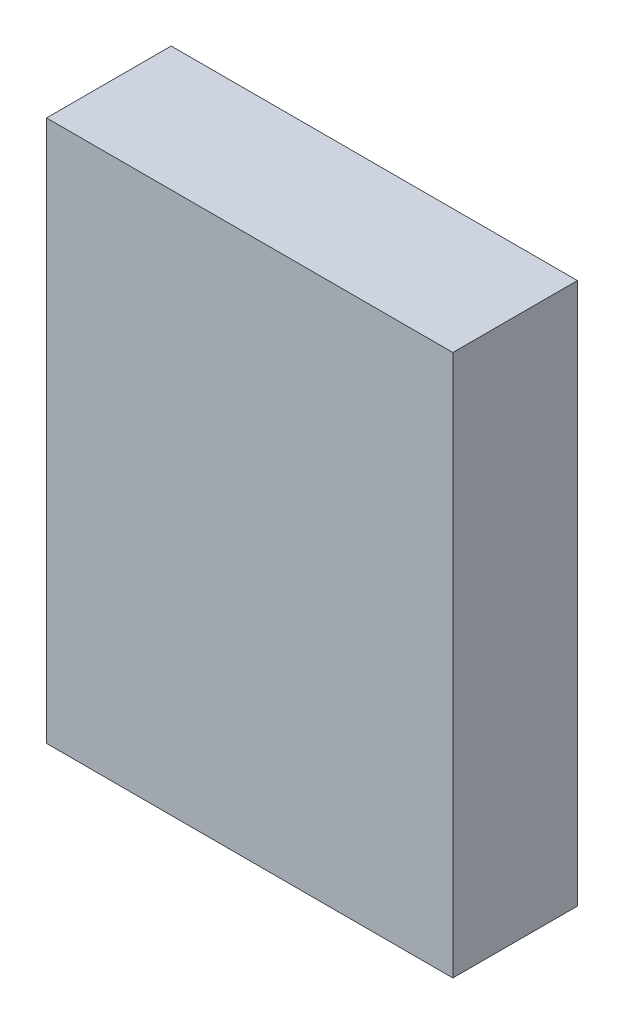
ISO-10303-21;
HEADER;
FILE_DESCRIPTION(('STEP AP214'),'2;1');
FILE_NAME('part.step','',(''),(''),'','','');
FILE_SCHEMA(('AUTOMOTIVE_DESIGN { 1 0 10303 214 1 1 1 1 }'));
ENDSEC;
DATA;
#1=APPLICATION_CONTEXT('core data for automotive mechanical design processes');
#2=APPLICATION_PROTOCOL_DEFINITION('international standard','automotive_design',2000,#1);
#3=PRODUCT_CONTEXT('',#1,'mechanical');
#4=PRODUCT('Part','Part','',(#3));
#5=PRODUCT_RELATED_PRODUCT_CATEGORY('part','',(#4));
#6=PRODUCT_DEFINITION_FORMATION('','',#4);
#7=PRODUCT_DEFINITION_CONTEXT('part definition',#1,'design');
#8=PRODUCT_DEFINITION('design','',#6,#7);
#9=PRODUCT_DEFINITION_SHAPE('','',#8);
#10=(LENGTH_UNIT() NAMED_UNIT(*) SI_UNIT(.MILLI.,.METRE.));
#11=(NAMED_UNIT(*) PLANE_ANGLE_UNIT() SI_UNIT($,.RADIAN.));
#12=(NAMED_UNIT(*) SI_UNIT($,.STERADIAN.) SOLID_ANGLE_UNIT());
#13=UNCERTAINTY_MEASURE_WITH_UNIT(LENGTH_MEASURE(1.E-05),#10,'distance_accuracy_value','');
#14=(GEOMETRIC_REPRESENTATION_CONTEXT(3) GLOBAL_UNCERTAINTY_ASSIGNED_CONTEXT((#13)) GLOBAL_UNIT_ASSIGNED_CONTEXT((#10,
#11,#12)) REPRESENTATION_CONTEXT('',''));
#15=CARTESIAN_POINT('',(0.,0.,0.));
#16=DIRECTION('',(0.,0.,1.));
#17=DIRECTION('',(1.,0.,0.));
#18=AXIS2_PLACEMENT_3D('',#15,#16,#17);
#19=CARTESIAN_POINT('',(0.,0.,2.3));
#20=DIRECTION('',(1.,0.,0.));
#21=DIRECTION('',(0.,0.,-1.));
#22=AXIS2_PLACEMENT_3D('',#19,#20,#21);
#23=PLANE('',#22);
#24=DIRECTION('',(0.,-1.,0.));
#25=VECTOR('',#24,1.);
#26=CARTESIAN_POINT('',(0.,0.,0.));
#27=LINE('',#26,#25);
#28=CARTESIAN_POINT('',(0.,10.,0.));
#29=VERTEX_POINT('',#28);
#30=CARTESIAN_POINT('',(0.,0.,0.));
#31=VERTEX_POINT('',#30);
#32=EDGE_CURVE('E79',#29,#31,#27,.T.);
#33=ORIENTED_EDGE('',*,*,#32,.T.);
#34=DIRECTION('',(0.,0.,-1.));
#35=VECTOR('',#34,1.);
#36=CARTESIAN_POINT('',(0.,0.,2.3));
#37=LINE('',#36,#35);
#38=CARTESIAN_POINT('',(0.,0.,2.3));
#39=VERTEX_POINT('',#38);
#40=EDGE_CURVE('E11',#39,#31,#37,.T.);
#41=ORIENTED_EDGE('',*,*,#40,.F.);
#42=DIRECTION('',(0.,-1.,0.));
#43=VECTOR('',#42,1.);
#44=CARTESIAN_POINT('',(0.,0.,2.3));
#45=LINE('',#44,#43);
#46=CARTESIAN_POINT('',(0.,10.,2.3));
#47=VERTEX_POINT('',#46);
#48=EDGE_CURVE('E67',#47,#39,#45,.T.);
#49=ORIENTED_EDGE('',*,*,#48,.F.);
#50=DIRECTION('',(0.,0.,-1.));
#51=VECTOR('',#50,1.);
#52=CARTESIAN_POINT('',(0.,10.,2.3));
#53=LINE('',#52,#51);
#54=EDGE_CURVE('E75',#47,#29,#53,.T.);
#55=ORIENTED_EDGE('',*,*,#54,.T.);
#56=EDGE_LOOP('',(#33,#41,#49,#55));
#57=FACE_BOUND('',#56,.T.);
#58=ADVANCED_FACE('F16',(#57),#23,.F.);
#59=CARTESIAN_POINT('',(0.,0.,2.3));
#60=DIRECTION('',(0.,1.,0.));
#61=DIRECTION('',(0.,0.,1.));
#62=AXIS2_PLACEMENT_3D('',#59,#60,#61);
#63=PLANE('',#62);
#64=DIRECTION('',(1.,0.,0.));
#65=VECTOR('',#64,1.);
#66=CARTESIAN_POINT('',(0.,0.,0.));
#67=LINE('',#66,#65);
#68=CARTESIAN_POINT('',(7.5,0.,0.));
#69=VERTEX_POINT('',#68);
#70=EDGE_CURVE('E71',#31,#69,#67,.T.);
#71=ORIENTED_EDGE('',*,*,#70,.T.);
#72=DIRECTION('',(0.,0.,-1.));
#73=VECTOR('',#72,1.);
#74=CARTESIAN_POINT('',(7.5,0.,2.3));
#75=LINE('',#74,#73);
#76=CARTESIAN_POINT('',(7.5,0.,2.3));
#77=VERTEX_POINT('',#76);
#78=EDGE_CURVE('E24',#77,#69,#75,.T.);
#79=ORIENTED_EDGE('',*,*,#78,.F.);
#80=DIRECTION('',(1.,0.,0.));
#81=VECTOR('',#80,1.);
#82=CARTESIAN_POINT('',(0.,0.,2.3));
#83=LINE('',#82,#81);
#84=EDGE_CURVE('E62',#39,#77,#83,.T.);
#85=ORIENTED_EDGE('',*,*,#84,.F.);
#86=ORIENTED_EDGE('',*,*,#40,.T.);
#87=EDGE_LOOP('',(#71,#79,#85,#86));
#88=FACE_BOUND('',#87,.T.);
#89=ADVANCED_FACE('F70',(#88),#63,.F.);
#90=CARTESIAN_POINT('',(7.5,0.,2.3));
#91=DIRECTION('',(-1.,0.,0.));
#92=DIRECTION('',(0.,0.,1.));
#93=AXIS2_PLACEMENT_3D('',#90,#91,#92);
#94=PLANE('',#93);
#95=DIRECTION('',(0.,1.,0.));
#96=VECTOR('',#95,1.);
#97=CARTESIAN_POINT('',(7.5,0.,0.));
#98=LINE('',#97,#96);
#99=CARTESIAN_POINT('',(7.5,10.,0.));
#100=VERTEX_POINT('',#99);
#101=EDGE_CURVE('E49',#69,#100,#98,.T.);
#102=ORIENTED_EDGE('',*,*,#101,.T.);
#103=DIRECTION('',(0.,0.,-1.));
#104=VECTOR('',#103,1.);
#105=CARTESIAN_POINT('',(7.5,10.,2.3));
#106=LINE('',#105,#104);
#107=CARTESIAN_POINT('',(7.5,10.,2.3));
#108=VERTEX_POINT('',#107);
#109=EDGE_CURVE('E72',#108,#100,#106,.T.);
#110=ORIENTED_EDGE('',*,*,#109,.F.);
#111=DIRECTION('',(0.,1.,0.));
#112=VECTOR('',#111,1.);
#113=CARTESIAN_POINT('',(7.5,0.,2.3));
#114=LINE('',#113,#112);
#115=EDGE_CURVE('E65',#77,#108,#114,.T.);
#116=ORIENTED_EDGE('',*,*,#115,.F.);
#117=ORIENTED_EDGE('',*,*,#78,.T.);
#118=EDGE_LOOP('',(#102,#110,#116,#117));
#119=FACE_BOUND('',#118,.T.);
#120=ADVANCED_FACE('F73',(#119),#94,.F.);
#121=CARTESIAN_POINT('',(0.,10.,2.3));
#122=DIRECTION('',(0.,-1.,0.));
#123=DIRECTION('',(0.,0.,-1.));
#124=AXIS2_PLACEMENT_3D('',#121,#122,#123);
#125=PLANE('',#124);
#126=DIRECTION('',(-1.,0.,0.));
#127=VECTOR('',#126,1.);
#128=CARTESIAN_POINT('',(0.,10.,0.));
#129=LINE('',#128,#127);
#130=EDGE_CURVE('E55',#100,#29,#129,.T.);
#131=ORIENTED_EDGE('',*,*,#130,.T.);
#132=ORIENTED_EDGE('',*,*,#54,.F.);
#133=DIRECTION('',(-1.,0.,0.));
#134=VECTOR('',#133,1.);
#135=CARTESIAN_POINT('',(0.,10.,2.3));
#136=LINE('',#135,#134);
#137=EDGE_CURVE('E32',#108,#47,#136,.T.);
#138=ORIENTED_EDGE('',*,*,#137,.F.);
#139=ORIENTED_EDGE('',*,*,#109,.T.);
#140=EDGE_LOOP('',(#131,#132,#138,#139));
#141=FACE_BOUND('',#140,.T.);
#142=ADVANCED_FACE('F86',(#141),#125,.F.);
#143=CARTESIAN_POINT('',(0.,0.,2.3));
#144=DIRECTION('',(0.,0.,-1.));
#145=DIRECTION('',(-1.,0.,0.));
#146=AXIS2_PLACEMENT_3D('',#143,#144,#145);
#147=PLANE('',#146);
#148=ORIENTED_EDGE('',*,*,#48,.T.);
#149=ORIENTED_EDGE('',*,*,#84,.T.);
#150=ORIENTED_EDGE('',*,*,#115,.T.);
#151=ORIENTED_EDGE('',*,*,#137,.T.);
#152=EDGE_LOOP('',(#148,#149,#150,#151));
#153=FACE_BOUND('',#152,.T.);
#154=ADVANCED_FACE('F63',(#153),#147,.F.);
#155=CARTESIAN_POINT('',(0.,0.,0.));
#156=DIRECTION('',(0.,0.,-1.));
#157=DIRECTION('',(-1.,0.,0.));
#158=AXIS2_PLACEMENT_3D('',#155,#156,#157);
#159=PLANE('',#158);
#160=ORIENTED_EDGE('',*,*,#32,.F.);
#161=ORIENTED_EDGE('',*,*,#130,.F.);
#162=ORIENTED_EDGE('',*,*,#101,.F.);
#163=ORIENTED_EDGE('',*,*,#70,.F.);
#164=EDGE_LOOP('',(#160,#161,#162,#163));
#165=FACE_BOUND('',#164,.T.);
#166=ADVANCED_FACE('F89',(#165),#159,.T.);
#167=CLOSED_SHELL('',(#58,#89,#120,#142,#154,#166));
#168=MANIFOLD_SOLID_BREP('B1',#167);
#169=ADVANCED_BREP_SHAPE_REPRESENTATION('',(#18,#168),#14);
#170=SHAPE_DEFINITION_REPRESENTATION(#9,#169);
ENDSEC;
END-ISO-10303-21;
